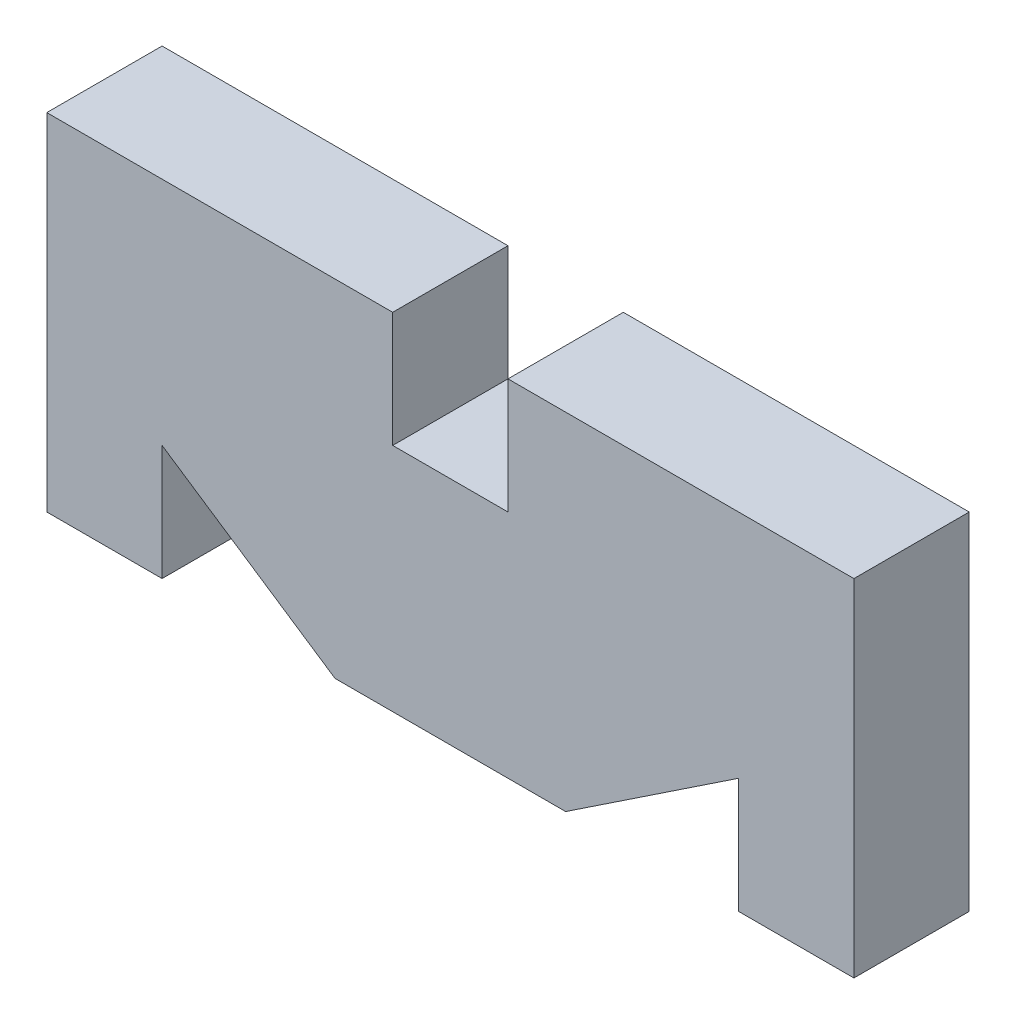
ISO-10303-21;
HEADER;
FILE_DESCRIPTION(('STEP AP214'),'2;1');
FILE_NAME('part.step','',(''),(''),'','','');
FILE_SCHEMA(('AUTOMOTIVE_DESIGN { 1 0 10303 214 1 1 1 1 }'));
ENDSEC;
DATA;
#1=APPLICATION_CONTEXT('core data for automotive mechanical design processes');
#2=APPLICATION_PROTOCOL_DEFINITION('international standard','automotive_design',2000,#1);
#3=PRODUCT_CONTEXT('',#1,'mechanical');
#4=PRODUCT('Part','Part','',(#3));
#5=PRODUCT_RELATED_PRODUCT_CATEGORY('part','',(#4));
#6=PRODUCT_DEFINITION_FORMATION('','',#4);
#7=PRODUCT_DEFINITION_CONTEXT('part definition',#1,'design');
#8=PRODUCT_DEFINITION('design','',#6,#7);
#9=PRODUCT_DEFINITION_SHAPE('','',#8);
#10=(LENGTH_UNIT() NAMED_UNIT(*) SI_UNIT(.MILLI.,.METRE.));
#11=(NAMED_UNIT(*) PLANE_ANGLE_UNIT() SI_UNIT($,.RADIAN.));
#12=(NAMED_UNIT(*) SI_UNIT($,.STERADIAN.) SOLID_ANGLE_UNIT());
#13=UNCERTAINTY_MEASURE_WITH_UNIT(LENGTH_MEASURE(1.E-05),#10,'distance_accuracy_value','');
#14=(GEOMETRIC_REPRESENTATION_CONTEXT(3) GLOBAL_UNCERTAINTY_ASSIGNED_CONTEXT((#13)) GLOBAL_UNIT_ASSIGNED_CONTEXT((#10,
#11,#12)) REPRESENTATION_CONTEXT('',''));
#15=CARTESIAN_POINT('',(0.,0.,0.));
#16=DIRECTION('',(0.,0.,1.));
#17=DIRECTION('',(1.,0.,0.));
#18=AXIS2_PLACEMENT_3D('',#15,#16,#17);
#19=CARTESIAN_POINT('',(25.,-15.,10.));
#20=DIRECTION('',(0.,1.,0.));
#21=DIRECTION('',(0.,0.,1.));
#22=AXIS2_PLACEMENT_3D('',#19,#20,#21);
#23=PLANE('',#22);
#24=DIRECTION('',(1.,0.,0.));
#25=VECTOR('',#24,1.);
#26=CARTESIAN_POINT('',(25.,-15.,0.));
#27=LINE('',#26,#25);
#28=CARTESIAN_POINT('',(25.,-15.,0.));
#29=VERTEX_POINT('',#28);
#30=CARTESIAN_POINT('',(35.,-15.,0.));
#31=VERTEX_POINT('',#30);
#32=EDGE_CURVE('E178',#29,#31,#27,.T.);
#33=ORIENTED_EDGE('',*,*,#32,.T.);
#34=DIRECTION('',(0.,0.,-1.));
#35=VECTOR('',#34,1.);
#36=CARTESIAN_POINT('',(35.,-15.,10.));
#37=LINE('',#36,#35);
#38=CARTESIAN_POINT('',(35.,-15.,10.));
#39=VERTEX_POINT('',#38);
#40=EDGE_CURVE('E11',#39,#31,#37,.T.);
#41=ORIENTED_EDGE('',*,*,#40,.F.);
#42=DIRECTION('',(1.,0.,0.));
#43=VECTOR('',#42,1.);
#44=CARTESIAN_POINT('',(25.,-15.,10.));
#45=LINE('',#44,#43);
#46=CARTESIAN_POINT('',(25.,-15.,10.));
#47=VERTEX_POINT('',#46);
#48=EDGE_CURVE('E218',#47,#39,#45,.T.);
#49=ORIENTED_EDGE('',*,*,#48,.F.);
#50=DIRECTION('',(0.,0.,-1.));
#51=VECTOR('',#50,1.);
#52=CARTESIAN_POINT('',(25.,-15.,10.));
#53=LINE('',#52,#51);
#54=EDGE_CURVE('E174',#47,#29,#53,.T.);
#55=ORIENTED_EDGE('',*,*,#54,.T.);
#56=EDGE_LOOP('',(#33,#41,#49,#55));
#57=FACE_BOUND('',#56,.T.);
#58=ADVANCED_FACE('F41',(#57),#23,.F.);
#59=CARTESIAN_POINT('',(35.,15.,10.));
#60=DIRECTION('',(-1.,0.,0.));
#61=DIRECTION('',(0.,-1.,0.));
#62=AXIS2_PLACEMENT_3D('',#59,#60,#61);
#63=PLANE('',#62);
#64=DIRECTION('',(0.,1.,0.));
#65=VECTOR('',#64,1.);
#66=CARTESIAN_POINT('',(35.,15.,0.));
#67=LINE('',#66,#65);
#68=CARTESIAN_POINT('',(35.,15.,0.));
#69=VERTEX_POINT('',#68);
#70=EDGE_CURVE('E182',#31,#69,#67,.T.);
#71=ORIENTED_EDGE('',*,*,#70,.T.);
#72=DIRECTION('',(0.,0.,-1.));
#73=VECTOR('',#72,1.);
#74=CARTESIAN_POINT('',(35.,15.,10.));
#75=LINE('',#74,#73);
#76=CARTESIAN_POINT('',(35.,15.,10.));
#77=VERTEX_POINT('',#76);
#78=EDGE_CURVE('E50',#77,#69,#75,.T.);
#79=ORIENTED_EDGE('',*,*,#78,.F.);
#80=DIRECTION('',(0.,1.,0.));
#81=VECTOR('',#80,1.);
#82=CARTESIAN_POINT('',(35.,15.,10.));
#83=LINE('',#82,#81);
#84=EDGE_CURVE('E119',#39,#77,#83,.T.);
#85=ORIENTED_EDGE('',*,*,#84,.F.);
#86=ORIENTED_EDGE('',*,*,#40,.T.);
#87=EDGE_LOOP('',(#71,#79,#85,#86));
#88=FACE_BOUND('',#87,.T.);
#89=ADVANCED_FACE('F326',(#88),#63,.F.);
#90=CARTESIAN_POINT('',(5.,15.,10.));
#91=DIRECTION('',(0.,-1.,0.));
#92=DIRECTION('',(0.,0.,-1.));
#93=AXIS2_PLACEMENT_3D('',#90,#91,#92);
#94=PLANE('',#93);
#95=DIRECTION('',(-1.,0.,0.));
#96=VECTOR('',#95,1.);
#97=CARTESIAN_POINT('',(5.,15.,0.));
#98=LINE('',#97,#96);
#99=CARTESIAN_POINT('',(5.,15.,0.));
#100=VERTEX_POINT('',#99);
#101=EDGE_CURVE('E185',#69,#100,#98,.T.);
#102=ORIENTED_EDGE('',*,*,#101,.T.);
#103=DIRECTION('',(0.,0.,-1.));
#104=VECTOR('',#103,1.);
#105=CARTESIAN_POINT('',(5.,15.,10.));
#106=LINE('',#105,#104);
#107=CARTESIAN_POINT('',(5.,15.,10.));
#108=VERTEX_POINT('',#107);
#109=EDGE_CURVE('E253',#108,#100,#106,.T.);
#110=ORIENTED_EDGE('',*,*,#109,.F.);
#111=DIRECTION('',(-1.,0.,0.));
#112=VECTOR('',#111,1.);
#113=CARTESIAN_POINT('',(5.,15.,10.));
#114=LINE('',#113,#112);
#115=EDGE_CURVE('E263',#77,#108,#114,.T.);
#116=ORIENTED_EDGE('',*,*,#115,.F.);
#117=ORIENTED_EDGE('',*,*,#78,.T.);
#118=EDGE_LOOP('',(#102,#110,#116,#117));
#119=FACE_BOUND('',#118,.T.);
#120=ADVANCED_FACE('F261',(#119),#94,.F.);
#121=CARTESIAN_POINT('',(5.,15.,10.));
#122=DIRECTION('',(1.,0.,0.));
#123=DIRECTION('',(0.,1.,0.));
#124=AXIS2_PLACEMENT_3D('',#121,#122,#123);
#125=PLANE('',#124);
#126=DIRECTION('',(0.,-1.,0.));
#127=VECTOR('',#126,1.);
#128=CARTESIAN_POINT('',(5.,15.,0.));
#129=LINE('',#128,#127);
#130=CARTESIAN_POINT('',(5.,5.,0.));
#131=VERTEX_POINT('',#130);
#132=EDGE_CURVE('E188',#100,#131,#129,.T.);
#133=ORIENTED_EDGE('',*,*,#132,.T.);
#134=DIRECTION('',(0.,0.,-1.));
#135=VECTOR('',#134,1.);
#136=CARTESIAN_POINT('',(5.,5.,10.));
#137=LINE('',#136,#135);
#138=CARTESIAN_POINT('',(5.,5.,10.));
#139=VERTEX_POINT('',#138);
#140=EDGE_CURVE('E249',#139,#131,#137,.T.);
#141=ORIENTED_EDGE('',*,*,#140,.F.);
#142=DIRECTION('',(0.,-1.,0.));
#143=VECTOR('',#142,1.);
#144=CARTESIAN_POINT('',(5.,15.,10.));
#145=LINE('',#144,#143);
#146=EDGE_CURVE('E282',#108,#139,#145,.T.);
#147=ORIENTED_EDGE('',*,*,#146,.F.);
#148=ORIENTED_EDGE('',*,*,#109,.T.);
#149=EDGE_LOOP('',(#133,#141,#147,#148));
#150=FACE_BOUND('',#149,.T.);
#151=ADVANCED_FACE('F272',(#150),#125,.F.);
#152=CARTESIAN_POINT('',(-5.,5.,10.));
#153=DIRECTION('',(0.,-1.,0.));
#154=DIRECTION('',(0.,0.,-1.));
#155=AXIS2_PLACEMENT_3D('',#152,#153,#154);
#156=PLANE('',#155);
#157=DIRECTION('',(-1.,0.,0.));
#158=VECTOR('',#157,1.);
#159=CARTESIAN_POINT('',(-5.,5.,0.));
#160=LINE('',#159,#158);
#161=CARTESIAN_POINT('',(-5.,5.,0.));
#162=VERTEX_POINT('',#161);
#163=EDGE_CURVE('E191',#131,#162,#160,.T.);
#164=ORIENTED_EDGE('',*,*,#163,.T.);
#165=DIRECTION('',(0.,0.,-1.));
#166=VECTOR('',#165,1.);
#167=CARTESIAN_POINT('',(-5.,5.,10.));
#168=LINE('',#167,#166);
#169=CARTESIAN_POINT('',(-5.,5.,10.));
#170=VERTEX_POINT('',#169);
#171=EDGE_CURVE('E245',#170,#162,#168,.T.);
#172=ORIENTED_EDGE('',*,*,#171,.F.);
#173=DIRECTION('',(-1.,0.,0.));
#174=VECTOR('',#173,1.);
#175=CARTESIAN_POINT('',(-5.,5.,10.));
#176=LINE('',#175,#174);
#177=EDGE_CURVE('E278',#139,#170,#176,.T.);
#178=ORIENTED_EDGE('',*,*,#177,.F.);
#179=ORIENTED_EDGE('',*,*,#140,.T.);
#180=EDGE_LOOP('',(#164,#172,#178,#179));
#181=FACE_BOUND('',#180,.T.);
#182=ADVANCED_FACE('F276',(#181),#156,.F.);
#183=CARTESIAN_POINT('',(-5.,15.,10.));
#184=DIRECTION('',(-1.,0.,0.));
#185=DIRECTION('',(0.,-1.,0.));
#186=AXIS2_PLACEMENT_3D('',#183,#184,#185);
#187=PLANE('',#186);
#188=DIRECTION('',(0.,1.,0.));
#189=VECTOR('',#188,1.);
#190=CARTESIAN_POINT('',(-5.,15.,0.));
#191=LINE('',#190,#189);
#192=CARTESIAN_POINT('',(-5.,15.,0.));
#193=VERTEX_POINT('',#192);
#194=EDGE_CURVE('E194',#162,#193,#191,.T.);
#195=ORIENTED_EDGE('',*,*,#194,.T.);
#196=DIRECTION('',(0.,0.,-1.));
#197=VECTOR('',#196,1.);
#198=CARTESIAN_POINT('',(-5.,15.,10.));
#199=LINE('',#198,#197);
#200=CARTESIAN_POINT('',(-5.,15.,10.));
#201=VERTEX_POINT('',#200);
#202=EDGE_CURVE('E241',#201,#193,#199,.T.);
#203=ORIENTED_EDGE('',*,*,#202,.F.);
#204=DIRECTION('',(0.,1.,0.));
#205=VECTOR('',#204,1.);
#206=CARTESIAN_POINT('',(-5.,15.,10.));
#207=LINE('',#206,#205);
#208=EDGE_CURVE('E281',#170,#201,#207,.T.);
#209=ORIENTED_EDGE('',*,*,#208,.F.);
#210=ORIENTED_EDGE('',*,*,#171,.T.);
#211=EDGE_LOOP('',(#195,#203,#209,#210));
#212=FACE_BOUND('',#211,.T.);
#213=ADVANCED_FACE('F339',(#212),#187,.F.);
#214=CARTESIAN_POINT('',(-35.,15.,10.));
#215=DIRECTION('',(0.,-1.,0.));
#216=DIRECTION('',(0.,0.,-1.));
#217=AXIS2_PLACEMENT_3D('',#214,#215,#216);
#218=PLANE('',#217);
#219=DIRECTION('',(-1.,0.,0.));
#220=VECTOR('',#219,1.);
#221=CARTESIAN_POINT('',(-35.,15.,0.));
#222=LINE('',#221,#220);
#223=CARTESIAN_POINT('',(-35.,15.,0.));
#224=VERTEX_POINT('',#223);
#225=EDGE_CURVE('E197',#193,#224,#222,.T.);
#226=ORIENTED_EDGE('',*,*,#225,.T.);
#227=DIRECTION('',(0.,0.,-1.));
#228=VECTOR('',#227,1.);
#229=CARTESIAN_POINT('',(-35.,15.,10.));
#230=LINE('',#229,#228);
#231=CARTESIAN_POINT('',(-35.,15.,10.));
#232=VERTEX_POINT('',#231);
#233=EDGE_CURVE('E237',#232,#224,#230,.T.);
#234=ORIENTED_EDGE('',*,*,#233,.F.);
#235=DIRECTION('',(-1.,0.,0.));
#236=VECTOR('',#235,1.);
#237=CARTESIAN_POINT('',(-35.,15.,10.));
#238=LINE('',#237,#236);
#239=EDGE_CURVE('E286',#201,#232,#238,.T.);
#240=ORIENTED_EDGE('',*,*,#239,.F.);
#241=ORIENTED_EDGE('',*,*,#202,.T.);
#242=EDGE_LOOP('',(#226,#234,#240,#241));
#243=FACE_BOUND('',#242,.T.);
#244=ADVANCED_FACE('F342',(#243),#218,.F.);
#245=CARTESIAN_POINT('',(-35.,15.,10.));
#246=DIRECTION('',(1.,0.,0.));
#247=DIRECTION('',(0.,1.,0.));
#248=AXIS2_PLACEMENT_3D('',#245,#246,#247);
#249=PLANE('',#248);
#250=DIRECTION('',(0.,-1.,0.));
#251=VECTOR('',#250,1.);
#252=CARTESIAN_POINT('',(-35.,15.,0.));
#253=LINE('',#252,#251);
#254=CARTESIAN_POINT('',(-35.,-15.,0.));
#255=VERTEX_POINT('',#254);
#256=EDGE_CURVE('E200',#224,#255,#253,.T.);
#257=ORIENTED_EDGE('',*,*,#256,.T.);
#258=DIRECTION('',(0.,0.,-1.));
#259=VECTOR('',#258,1.);
#260=CARTESIAN_POINT('',(-35.,-15.,10.));
#261=LINE('',#260,#259);
#262=CARTESIAN_POINT('',(-35.,-15.,10.));
#263=VERTEX_POINT('',#262);
#264=EDGE_CURVE('E233',#263,#255,#261,.T.);
#265=ORIENTED_EDGE('',*,*,#264,.F.);
#266=DIRECTION('',(0.,-1.,0.));
#267=VECTOR('',#266,1.);
#268=CARTESIAN_POINT('',(-35.,15.,10.));
#269=LINE('',#268,#267);
#270=EDGE_CURVE('E293',#232,#263,#269,.T.);
#271=ORIENTED_EDGE('',*,*,#270,.F.);
#272=ORIENTED_EDGE('',*,*,#233,.T.);
#273=EDGE_LOOP('',(#257,#265,#271,#272));
#274=FACE_BOUND('',#273,.T.);
#275=ADVANCED_FACE('F346',(#274),#249,.F.);
#276=CARTESIAN_POINT('',(-35.,-15.,10.));
#277=DIRECTION('',(0.,1.,0.));
#278=DIRECTION('',(-1.,0.,0.));
#279=AXIS2_PLACEMENT_3D('',#276,#277,#278);
#280=PLANE('',#279);
#281=DIRECTION('',(1.,0.,0.));
#282=VECTOR('',#281,1.);
#283=CARTESIAN_POINT('',(-35.,-15.,0.));
#284=LINE('',#283,#282);
#285=CARTESIAN_POINT('',(-25.,-15.,0.));
#286=VERTEX_POINT('',#285);
#287=EDGE_CURVE('E203',#255,#286,#284,.T.);
#288=ORIENTED_EDGE('',*,*,#287,.T.);
#289=DIRECTION('',(0.,0.,-1.));
#290=VECTOR('',#289,1.);
#291=CARTESIAN_POINT('',(-25.,-15.,10.));
#292=LINE('',#291,#290);
#293=CARTESIAN_POINT('',(-25.,-15.,10.));
#294=VERTEX_POINT('',#293);
#295=EDGE_CURVE('E229',#294,#286,#292,.T.);
#296=ORIENTED_EDGE('',*,*,#295,.F.);
#297=DIRECTION('',(1.,0.,0.));
#298=VECTOR('',#297,1.);
#299=CARTESIAN_POINT('',(-35.,-15.,10.));
#300=LINE('',#299,#298);
#301=EDGE_CURVE('E296',#263,#294,#300,.T.);
#302=ORIENTED_EDGE('',*,*,#301,.F.);
#303=ORIENTED_EDGE('',*,*,#264,.T.);
#304=EDGE_LOOP('',(#288,#296,#302,#303));
#305=FACE_BOUND('',#304,.T.);
#306=ADVANCED_FACE('F350',(#305),#280,.F.);
#307=CARTESIAN_POINT('',(-25.,-4.99999999999997,10.));
#308=DIRECTION('',(-1.,0.,0.));
#309=DIRECTION('',(0.,-1.,0.));
#310=AXIS2_PLACEMENT_3D('',#307,#308,#309);
#311=PLANE('',#310);
#312=DIRECTION('',(0.,1.,0.));
#313=VECTOR('',#312,1.);
#314=CARTESIAN_POINT('',(-25.,-4.99999999999997,0.));
#315=LINE('',#314,#313);
#316=CARTESIAN_POINT('',(-25.,-4.99999999999997,0.));
#317=VERTEX_POINT('',#316);
#318=EDGE_CURVE('E206',#286,#317,#315,.T.);
#319=ORIENTED_EDGE('',*,*,#318,.T.);
#320=DIRECTION('',(0.,0.,-1.));
#321=VECTOR('',#320,1.);
#322=CARTESIAN_POINT('',(-25.,-4.99999999999997,10.));
#323=LINE('',#322,#321);
#324=CARTESIAN_POINT('',(-25.,-4.99999999999997,10.));
#325=VERTEX_POINT('',#324);
#326=EDGE_CURVE('E225',#325,#317,#323,.T.);
#327=ORIENTED_EDGE('',*,*,#326,.F.);
#328=DIRECTION('',(0.,1.,0.));
#329=VECTOR('',#328,1.);
#330=CARTESIAN_POINT('',(-25.,-4.99999999999997,10.));
#331=LINE('',#330,#329);
#332=EDGE_CURVE('E299',#294,#325,#331,.T.);
#333=ORIENTED_EDGE('',*,*,#332,.F.);
#334=ORIENTED_EDGE('',*,*,#295,.T.);
#335=EDGE_LOOP('',(#319,#327,#333,#334));
#336=FACE_BOUND('',#335,.T.);
#337=ADVANCED_FACE('F307',(#336),#311,.F.);
#338=CARTESIAN_POINT('',(-10.,-15.,10.));
#339=DIRECTION('',(0.55470019622523,0.832050294337843,0.));
#340=DIRECTION('',(-0.832050294337843,0.55470019622523,0.));
#341=AXIS2_PLACEMENT_3D('',#338,#339,#340);
#342=PLANE('',#341);
#343=DIRECTION('',(0.832050294337843,-0.55470019622523,0.));
#344=VECTOR('',#343,1.);
#345=CARTESIAN_POINT('',(-10.,-15.,0.));
#346=LINE('',#345,#344);
#347=CARTESIAN_POINT('',(-10.,-15.,0.));
#348=VERTEX_POINT('',#347);
#349=EDGE_CURVE('E209',#317,#348,#346,.T.);
#350=ORIENTED_EDGE('',*,*,#349,.T.);
#351=DIRECTION('',(0.,0.,-1.));
#352=VECTOR('',#351,1.);
#353=CARTESIAN_POINT('',(-10.,-15.,10.));
#354=LINE('',#353,#352);
#355=CARTESIAN_POINT('',(-10.,-15.,10.));
#356=VERTEX_POINT('',#355);
#357=EDGE_CURVE('E167',#356,#348,#354,.T.);
#358=ORIENTED_EDGE('',*,*,#357,.F.);
#359=DIRECTION('',(0.832050294337843,-0.55470019622523,0.));
#360=VECTOR('',#359,1.);
#361=CARTESIAN_POINT('',(-10.,-15.,10.));
#362=LINE('',#361,#360);
#363=EDGE_CURVE('E156',#325,#356,#362,.T.);
#364=ORIENTED_EDGE('',*,*,#363,.F.);
#365=ORIENTED_EDGE('',*,*,#326,.T.);
#366=EDGE_LOOP('',(#350,#358,#364,#365));
#367=FACE_BOUND('',#366,.T.);
#368=ADVANCED_FACE('F311',(#367),#342,.F.);
#369=CARTESIAN_POINT('',(-10.,-15.,10.));
#370=DIRECTION('',(0.,1.,0.));
#371=DIRECTION('',(-1.,0.,0.));
#372=AXIS2_PLACEMENT_3D('',#369,#370,#371);
#373=PLANE('',#372);
#374=DIRECTION('',(1.,0.,0.));
#375=VECTOR('',#374,1.);
#376=CARTESIAN_POINT('',(-10.,-15.,0.));
#377=LINE('',#376,#375);
#378=CARTESIAN_POINT('',(10.,-15.,0.));
#379=VERTEX_POINT('',#378);
#380=EDGE_CURVE('E165',#348,#379,#377,.T.);
#381=ORIENTED_EDGE('',*,*,#380,.T.);
#382=DIRECTION('',(0.,0.,-1.));
#383=VECTOR('',#382,1.);
#384=CARTESIAN_POINT('',(10.,-15.,10.));
#385=LINE('',#384,#383);
#386=CARTESIAN_POINT('',(10.,-15.,10.));
#387=VERTEX_POINT('',#386);
#388=EDGE_CURVE('E162',#387,#379,#385,.T.);
#389=ORIENTED_EDGE('',*,*,#388,.F.);
#390=DIRECTION('',(1.,0.,0.));
#391=VECTOR('',#390,1.);
#392=CARTESIAN_POINT('',(-10.,-15.,10.));
#393=LINE('',#392,#391);
#394=EDGE_CURVE('E150',#356,#387,#393,.T.);
#395=ORIENTED_EDGE('',*,*,#394,.F.);
#396=ORIENTED_EDGE('',*,*,#357,.T.);
#397=EDGE_LOOP('',(#381,#389,#395,#396));
#398=FACE_BOUND('',#397,.T.);
#399=ADVANCED_FACE('F163',(#398),#373,.F.);
#400=CARTESIAN_POINT('',(10.,-15.,10.));
#401=DIRECTION('',(-0.554700196225229,0.832050294337844,0.));
#402=DIRECTION('',(-0.832050294337844,-0.554700196225229,0.));
#403=AXIS2_PLACEMENT_3D('',#400,#401,#402);
#404=PLANE('',#403);
#405=DIRECTION('',(0.832050294337844,0.554700196225229,0.));
#406=VECTOR('',#405,1.);
#407=CARTESIAN_POINT('',(10.,-15.,0.));
#408=LINE('',#407,#406);
#409=CARTESIAN_POINT('',(25.,-5.,0.));
#410=VERTEX_POINT('',#409);
#411=EDGE_CURVE('E105',#379,#410,#408,.T.);
#412=ORIENTED_EDGE('',*,*,#411,.T.);
#413=DIRECTION('',(0.,0.,-1.));
#414=VECTOR('',#413,1.);
#415=CARTESIAN_POINT('',(25.,-5.,10.));
#416=LINE('',#415,#414);
#417=CARTESIAN_POINT('',(25.,-5.,10.));
#418=VERTEX_POINT('',#417);
#419=EDGE_CURVE('E168',#418,#410,#416,.T.);
#420=ORIENTED_EDGE('',*,*,#419,.F.);
#421=DIRECTION('',(0.832050294337844,0.554700196225229,0.));
#422=VECTOR('',#421,1.);
#423=CARTESIAN_POINT('',(10.,-15.,10.));
#424=LINE('',#423,#422);
#425=EDGE_CURVE('E154',#387,#418,#424,.T.);
#426=ORIENTED_EDGE('',*,*,#425,.F.);
#427=ORIENTED_EDGE('',*,*,#388,.T.);
#428=EDGE_LOOP('',(#412,#420,#426,#427));
#429=FACE_BOUND('',#428,.T.);
#430=ADVANCED_FACE('F170',(#429),#404,.F.);
#431=CARTESIAN_POINT('',(25.,-5.,10.));
#432=DIRECTION('',(1.,0.,0.));
#433=DIRECTION('',(0.,0.,-1.));
#434=AXIS2_PLACEMENT_3D('',#431,#432,#433);
#435=PLANE('',#434);
#436=DIRECTION('',(0.,-1.,0.));
#437=VECTOR('',#436,1.);
#438=CARTESIAN_POINT('',(25.,-5.,0.));
#439=LINE('',#438,#437);
#440=EDGE_CURVE('E111',#410,#29,#439,.T.);
#441=ORIENTED_EDGE('',*,*,#440,.T.);
#442=ORIENTED_EDGE('',*,*,#54,.F.);
#443=DIRECTION('',(0.,-1.,0.));
#444=VECTOR('',#443,1.);
#445=CARTESIAN_POINT('',(25.,-5.,10.));
#446=LINE('',#445,#444);
#447=EDGE_CURVE('E58',#418,#47,#446,.T.);
#448=ORIENTED_EDGE('',*,*,#447,.F.);
#449=ORIENTED_EDGE('',*,*,#419,.T.);
#450=EDGE_LOOP('',(#441,#442,#448,#449));
#451=FACE_BOUND('',#450,.T.);
#452=ADVANCED_FACE('F315',(#451),#435,.F.);
#453=CARTESIAN_POINT('',(0.,0.,10.));
#454=DIRECTION('',(0.,0.,-1.));
#455=DIRECTION('',(-1.,0.,0.));
#456=AXIS2_PLACEMENT_3D('',#453,#454,#455);
#457=PLANE('',#456);
#458=ORIENTED_EDGE('',*,*,#48,.T.);
#459=ORIENTED_EDGE('',*,*,#84,.T.);
#460=ORIENTED_EDGE('',*,*,#115,.T.);
#461=ORIENTED_EDGE('',*,*,#146,.T.);
#462=ORIENTED_EDGE('',*,*,#177,.T.);
#463=ORIENTED_EDGE('',*,*,#208,.T.);
#464=ORIENTED_EDGE('',*,*,#239,.T.);
#465=ORIENTED_EDGE('',*,*,#270,.T.);
#466=ORIENTED_EDGE('',*,*,#301,.T.);
#467=ORIENTED_EDGE('',*,*,#332,.T.);
#468=ORIENTED_EDGE('',*,*,#363,.T.);
#469=ORIENTED_EDGE('',*,*,#394,.T.);
#470=ORIENTED_EDGE('',*,*,#425,.T.);
#471=ORIENTED_EDGE('',*,*,#447,.T.);
#472=EDGE_LOOP('',(#458,#459,#460,#461,#462,#463,#464,#465,#466,#467,#468,#469,#470,#471));
#473=FACE_BOUND('',#472,.T.);
#474=ADVANCED_FACE('F152',(#473),#457,.F.);
#475=CARTESIAN_POINT('',(0.,0.,0.));
#476=DIRECTION('',(0.,0.,-1.));
#477=DIRECTION('',(-1.,0.,0.));
#478=AXIS2_PLACEMENT_3D('',#475,#476,#477);
#479=PLANE('',#478);
#480=ORIENTED_EDGE('',*,*,#32,.F.);
#481=ORIENTED_EDGE('',*,*,#440,.F.);
#482=ORIENTED_EDGE('',*,*,#411,.F.);
#483=ORIENTED_EDGE('',*,*,#380,.F.);
#484=ORIENTED_EDGE('',*,*,#349,.F.);
#485=ORIENTED_EDGE('',*,*,#318,.F.);
#486=ORIENTED_EDGE('',*,*,#287,.F.);
#487=ORIENTED_EDGE('',*,*,#256,.F.);
#488=ORIENTED_EDGE('',*,*,#225,.F.);
#489=ORIENTED_EDGE('',*,*,#194,.F.);
#490=ORIENTED_EDGE('',*,*,#163,.F.);
#491=ORIENTED_EDGE('',*,*,#132,.F.);
#492=ORIENTED_EDGE('',*,*,#101,.F.);
#493=ORIENTED_EDGE('',*,*,#70,.F.);
#494=EDGE_LOOP('',(#480,#481,#482,#483,#484,#485,#486,#487,#488,#489,#490,#491,#492,#493));
#495=FACE_BOUND('',#494,.T.);
#496=ADVANCED_FACE('F267',(#495),#479,.T.);
#497=CLOSED_SHELL('',(#58,#89,#120,#151,#182,#213,#244,#275,#306,#337,#368,#399,#430,#452,#474,#496));
#498=MANIFOLD_SOLID_BREP('B2',#497);
#499=ADVANCED_BREP_SHAPE_REPRESENTATION('',(#18,#498),#14);
#500=SHAPE_DEFINITION_REPRESENTATION(#9,#499);
ENDSEC;
END-ISO-10303-21;
